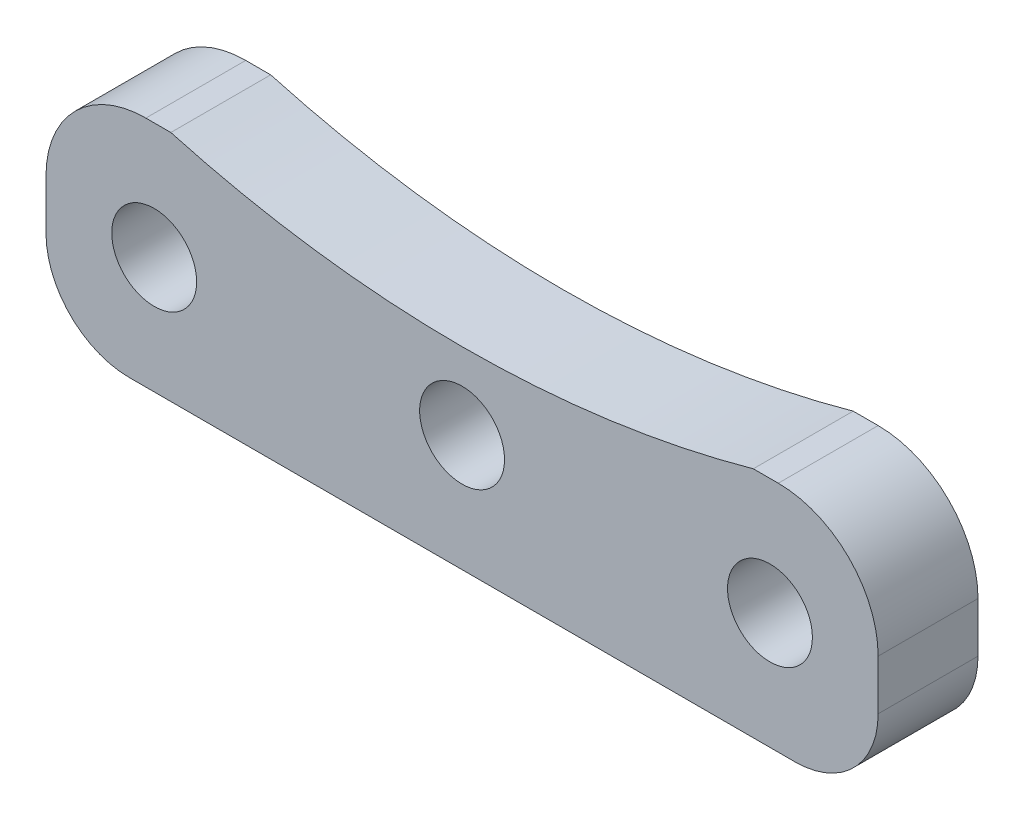
ISO-10303-21;
HEADER;
FILE_DESCRIPTION(('STEP AP214'),'2;1');
FILE_NAME('part.step','',(''),(''),'','','');
FILE_SCHEMA(('AUTOMOTIVE_DESIGN { 1 0 10303 214 1 1 1 1 }'));
ENDSEC;
DATA;
#1=APPLICATION_CONTEXT('core data for automotive mechanical design processes');
#2=APPLICATION_PROTOCOL_DEFINITION('international standard','automotive_design',2000,#1);
#3=PRODUCT_CONTEXT('',#1,'mechanical');
#4=PRODUCT('Part','Part','',(#3));
#5=PRODUCT_RELATED_PRODUCT_CATEGORY('part','',(#4));
#6=PRODUCT_DEFINITION_FORMATION('','',#4);
#7=PRODUCT_DEFINITION_CONTEXT('part definition',#1,'design');
#8=PRODUCT_DEFINITION('design','',#6,#7);
#9=PRODUCT_DEFINITION_SHAPE('','',#8);
#10=(LENGTH_UNIT() NAMED_UNIT(*) SI_UNIT(.MILLI.,.METRE.));
#11=(NAMED_UNIT(*) PLANE_ANGLE_UNIT() SI_UNIT($,.RADIAN.));
#12=(NAMED_UNIT(*) SI_UNIT($,.STERADIAN.) SOLID_ANGLE_UNIT());
#13=UNCERTAINTY_MEASURE_WITH_UNIT(LENGTH_MEASURE(1.E-05),#10,'distance_accuracy_value','');
#14=(GEOMETRIC_REPRESENTATION_CONTEXT(3) GLOBAL_UNCERTAINTY_ASSIGNED_CONTEXT((#13)) GLOBAL_UNIT_ASSIGNED_CONTEXT((#10,
#11,#12)) REPRESENTATION_CONTEXT('',''));
#15=CARTESIAN_POINT('',(0.,0.,0.));
#16=DIRECTION('',(0.,0.,1.));
#17=DIRECTION('',(1.,0.,0.));
#18=AXIS2_PLACEMENT_3D('',#15,#16,#17);
#19=CARTESIAN_POINT('',(896.804991665305,325.774798097188,6.));
#20=DIRECTION('',(0.,0.,-1.));
#21=DIRECTION('',(-1.,0.,0.));
#22=AXIS2_PLACEMENT_3D('',#19,#20,#21);
#23=CYLINDRICAL_SURFACE('',#22,65.1036279407735);
#24=CARTESIAN_POINT('',(896.804991665305,325.774798097188,0.));
#25=DIRECTION('',(0.,0.,1.));
#26=DIRECTION('',(1.,0.,0.));
#27=AXIS2_PLACEMENT_3D('',#24,#25,#26);
#28=CIRCLE('',#27,65.1036279407735);
#29=CARTESIAN_POINT('',(879.304991665024,263.067283626905,0.));
#30=VERTEX_POINT('',#29);
#31=CARTESIAN_POINT('',(914.304991665785,263.06728362696,0.));
#32=VERTEX_POINT('',#31);
#33=EDGE_CURVE('E11',#30,#32,#28,.T.);
#34=ORIENTED_EDGE('',*,*,#33,.F.);
#35=DIRECTION('',(0.,0.,-1.));
#36=VECTOR('',#35,1.);
#37=CARTESIAN_POINT('',(879.304991665024,263.067283626905,6.));
#38=LINE('',#37,#36);
#39=CARTESIAN_POINT('',(879.304991665024,263.067283626905,6.));
#40=VERTEX_POINT('',#39);
#41=EDGE_CURVE('E53',#40,#30,#38,.T.);
#42=ORIENTED_EDGE('',*,*,#41,.F.);
#43=CARTESIAN_POINT('',(896.804991665305,325.774798097188,6.));
#44=DIRECTION('',(0.,0.,1.));
#45=DIRECTION('',(1.,0.,0.));
#46=AXIS2_PLACEMENT_3D('',#43,#44,#45);
#47=CIRCLE('',#46,65.1036279407735);
#48=CARTESIAN_POINT('',(914.304991665785,263.06728362696,6.));
#49=VERTEX_POINT('',#48);
#50=EDGE_CURVE('E38',#40,#49,#47,.T.);
#51=ORIENTED_EDGE('',*,*,#50,.T.);
#52=DIRECTION('',(0.,0.,-1.));
#53=VECTOR('',#52,1.);
#54=CARTESIAN_POINT('',(914.304991665785,263.06728362696,6.));
#55=LINE('',#54,#53);
#56=EDGE_CURVE('E96',#49,#32,#55,.T.);
#57=ORIENTED_EDGE('',*,*,#56,.T.);
#58=EDGE_LOOP('',(#34,#42,#51,#57));
#59=FACE_BOUND('',#58,.T.);
#60=ADVANCED_FACE('F34',(#59),#23,.F.);
#61=CARTESIAN_POINT('',(1.92859169116805E-08,263.067283691368,6.));
#62=DIRECTION('',(-7.33117271028915E-11,-1.,0.));
#63=DIRECTION('',(1.,-7.33117271028915E-11,0.));
#64=AXIS2_PLACEMENT_3D('',#61,#62,#63);
#65=PLANE('',#64);
#66=DIRECTION('',(-1.,7.33117271028915E-11,0.));
#67=VECTOR('',#66,1.);
#68=CARTESIAN_POINT('',(1.92859169116805E-08,263.067283691368,0.));
#69=LINE('',#68,#67);
#70=CARTESIAN_POINT('',(877.804991665914,263.067283627015,0.));
#71=VERTEX_POINT('',#70);
#72=EDGE_CURVE('E44',#30,#71,#69,.T.);
#73=ORIENTED_EDGE('',*,*,#72,.T.);
#74=DIRECTION('',(0.,0.,-1.));
#75=VECTOR('',#74,1.);
#76=CARTESIAN_POINT('',(877.804991665914,263.067283627015,6.));
#77=LINE('',#76,#75);
#78=CARTESIAN_POINT('',(877.804991665914,263.067283627015,6.));
#79=VERTEX_POINT('',#78);
#80=EDGE_CURVE('E126',#79,#71,#77,.T.);
#81=ORIENTED_EDGE('',*,*,#80,.F.);
#82=DIRECTION('',(-1.,7.33117271028915E-11,0.));
#83=VECTOR('',#82,1.);
#84=CARTESIAN_POINT('',(1.92859169116805E-08,263.067283691368,6.));
#85=LINE('',#84,#83);
#86=EDGE_CURVE('E86',#40,#79,#85,.T.);
#87=ORIENTED_EDGE('',*,*,#86,.F.);
#88=ORIENTED_EDGE('',*,*,#41,.T.);
#89=EDGE_LOOP('',(#73,#81,#87,#88));
#90=FACE_BOUND('',#89,.T.);
#91=ADVANCED_FACE('F239',(#90),#65,.F.);
#92=CARTESIAN_POINT('',(877.804991665678,257.067283627129,6.));
#93=DIRECTION('',(0.,0.,-1.));
#94=DIRECTION('',(-1.,0.,0.));
#95=AXIS2_PLACEMENT_3D('',#92,#93,#94);
#96=CYLINDRICAL_SURFACE('',#95,5.99999999988587);
#97=CARTESIAN_POINT('',(877.804991665678,257.067283627129,0.));
#98=DIRECTION('',(0.,0.,1.));
#99=DIRECTION('',(1.,0.,0.));
#100=AXIS2_PLACEMENT_3D('',#97,#98,#99);
#101=CIRCLE('',#100,5.99999999988587);
#102=CARTESIAN_POINT('',(871.804991665792,257.067283627129,0.));
#103=VERTEX_POINT('',#102);
#104=EDGE_CURVE('E120',#71,#103,#101,.T.);
#105=ORIENTED_EDGE('',*,*,#104,.T.);
#106=DIRECTION('',(0.,0.,-1.));
#107=VECTOR('',#106,1.);
#108=CARTESIAN_POINT('',(871.804991665792,257.067283627129,6.));
#109=LINE('',#108,#107);
#110=CARTESIAN_POINT('',(871.804991665792,257.067283627129,6.));
#111=VERTEX_POINT('',#110);
#112=EDGE_CURVE('E124',#111,#103,#109,.T.);
#113=ORIENTED_EDGE('',*,*,#112,.F.);
#114=CARTESIAN_POINT('',(877.804991665678,257.067283627129,6.));
#115=DIRECTION('',(0.,0.,1.));
#116=DIRECTION('',(1.,0.,0.));
#117=AXIS2_PLACEMENT_3D('',#114,#115,#116);
#118=CIRCLE('',#117,5.99999999988587);
#119=EDGE_CURVE('E171',#79,#111,#118,.T.);
#120=ORIENTED_EDGE('',*,*,#119,.F.);
#121=ORIENTED_EDGE('',*,*,#80,.T.);
#122=EDGE_LOOP('',(#105,#113,#120,#121));
#123=FACE_BOUND('',#122,.T.);
#124=ADVANCED_FACE('F122',(#123),#96,.T.);
#125=CARTESIAN_POINT('',(871.804991681812,5.43313396423105E-08,6.));
#126=DIRECTION('',(1.,6.23205191077182E-11,0.));
#127=DIRECTION('',(-6.23205191077182E-11,1.,0.));
#128=AXIS2_PLACEMENT_3D('',#125,#126,#127);
#129=PLANE('',#128);
#130=DIRECTION('',(6.23205191077182E-11,-1.,0.));
#131=VECTOR('',#130,1.);
#132=CARTESIAN_POINT('',(871.804991681812,5.43313396423105E-08,0.));
#133=LINE('',#132,#131);
#134=CARTESIAN_POINT('',(871.804991665979,254.067283626748,0.));
#135=VERTEX_POINT('',#134);
#136=EDGE_CURVE('E129',#103,#135,#133,.T.);
#137=ORIENTED_EDGE('',*,*,#136,.T.);
#138=DIRECTION('',(0.,0.,-1.));
#139=VECTOR('',#138,1.);
#140=CARTESIAN_POINT('',(871.804991665979,254.067283626748,6.));
#141=LINE('',#140,#139);
#142=CARTESIAN_POINT('',(871.804991665979,254.067283626748,6.));
#143=VERTEX_POINT('',#142);
#144=EDGE_CURVE('E136',#143,#135,#141,.T.);
#145=ORIENTED_EDGE('',*,*,#144,.F.);
#146=DIRECTION('',(6.23205191077182E-11,-1.,0.));
#147=VECTOR('',#146,1.);
#148=CARTESIAN_POINT('',(871.804991681812,5.43313396423105E-08,6.));
#149=LINE('',#148,#147);
#150=EDGE_CURVE('E135',#111,#143,#149,.T.);
#151=ORIENTED_EDGE('',*,*,#150,.F.);
#152=ORIENTED_EDGE('',*,*,#112,.T.);
#153=EDGE_LOOP('',(#137,#145,#151,#152));
#154=FACE_BOUND('',#153,.T.);
#155=ADVANCED_FACE('F132',(#154),#129,.F.);
#156=CARTESIAN_POINT('',(876.804991665979,254.06728362706,6.));
#157=DIRECTION('',(0.,0.,-1.));
#158=DIRECTION('',(-1.,0.,0.));
#159=AXIS2_PLACEMENT_3D('',#156,#157,#158);
#160=CYLINDRICAL_SURFACE('',#159,4.99999999999995);
#161=CARTESIAN_POINT('',(876.804991665979,254.06728362706,0.));
#162=DIRECTION('',(0.,0.,1.));
#163=DIRECTION('',(1.,0.,0.));
#164=AXIS2_PLACEMENT_3D('',#161,#162,#163);
#165=CIRCLE('',#164,4.99999999999995);
#166=CARTESIAN_POINT('',(876.804991665979,249.06728362706,0.));
#167=VERTEX_POINT('',#166);
#168=EDGE_CURVE('E142',#135,#167,#165,.T.);
#169=ORIENTED_EDGE('',*,*,#168,.T.);
#170=DIRECTION('',(0.,0.,-1.));
#171=VECTOR('',#170,1.);
#172=CARTESIAN_POINT('',(876.804991665979,249.06728362706,6.));
#173=LINE('',#172,#171);
#174=CARTESIAN_POINT('',(876.804991665979,249.06728362706,6.));
#175=VERTEX_POINT('',#174);
#176=EDGE_CURVE('E202',#175,#167,#173,.T.);
#177=ORIENTED_EDGE('',*,*,#176,.F.);
#178=CARTESIAN_POINT('',(876.804991665979,254.06728362706,6.));
#179=DIRECTION('',(0.,0.,1.));
#180=DIRECTION('',(1.,0.,0.));
#181=AXIS2_PLACEMENT_3D('',#178,#179,#180);
#182=CIRCLE('',#181,4.99999999999995);
#183=EDGE_CURVE('E168',#143,#175,#182,.T.);
#184=ORIENTED_EDGE('',*,*,#183,.F.);
#185=ORIENTED_EDGE('',*,*,#144,.T.);
#186=EDGE_LOOP('',(#169,#177,#184,#185));
#187=FACE_BOUND('',#186,.T.);
#188=ADVANCED_FACE('F233',(#187),#160,.T.);
#189=CARTESIAN_POINT('',(0.,249.06728362706,6.));
#190=DIRECTION('',(0.,1.,0.));
#191=DIRECTION('',(0.,0.,1.));
#192=AXIS2_PLACEMENT_3D('',#189,#190,#191);
#193=PLANE('',#192);
#194=DIRECTION('',(1.,0.,0.));
#195=VECTOR('',#194,1.);
#196=CARTESIAN_POINT('',(0.,249.06728362706,0.));
#197=LINE('',#196,#195);
#198=CARTESIAN_POINT('',(916.804991665603,249.06728362706,0.));
#199=VERTEX_POINT('',#198);
#200=EDGE_CURVE('E144',#167,#199,#197,.T.);
#201=ORIENTED_EDGE('',*,*,#200,.T.);
#202=DIRECTION('',(0.,0.,-1.));
#203=VECTOR('',#202,1.);
#204=CARTESIAN_POINT('',(916.804991665603,249.06728362706,6.));
#205=LINE('',#204,#203);
#206=CARTESIAN_POINT('',(916.804991665603,249.06728362706,6.));
#207=VERTEX_POINT('',#206);
#208=EDGE_CURVE('E199',#207,#199,#205,.T.);
#209=ORIENTED_EDGE('',*,*,#208,.F.);
#210=DIRECTION('',(1.,0.,0.));
#211=VECTOR('',#210,1.);
#212=CARTESIAN_POINT('',(0.,249.06728362706,6.));
#213=LINE('',#212,#211);
#214=EDGE_CURVE('E166',#175,#207,#213,.T.);
#215=ORIENTED_EDGE('',*,*,#214,.F.);
#216=ORIENTED_EDGE('',*,*,#176,.T.);
#217=EDGE_LOOP('',(#201,#209,#215,#216));
#218=FACE_BOUND('',#217,.T.);
#219=ADVANCED_FACE('F197',(#218),#193,.F.);
#220=CARTESIAN_POINT('',(916.804991665604,254.06728362706,6.));
#221=DIRECTION('',(0.,0.,-1.));
#222=DIRECTION('',(-1.,0.,0.));
#223=AXIS2_PLACEMENT_3D('',#220,#221,#222);
#224=CYLINDRICAL_SURFACE('',#223,5.);
#225=CARTESIAN_POINT('',(916.804991665604,254.06728362706,0.));
#226=DIRECTION('',(0.,0.,1.));
#227=DIRECTION('',(1.,0.,0.));
#228=AXIS2_PLACEMENT_3D('',#225,#226,#227);
#229=CIRCLE('',#228,5.);
#230=CARTESIAN_POINT('',(921.804991665604,254.067283626743,0.));
#231=VERTEX_POINT('',#230);
#232=EDGE_CURVE('E192',#199,#231,#229,.T.);
#233=ORIENTED_EDGE('',*,*,#232,.T.);
#234=DIRECTION('',(0.,0.,-1.));
#235=VECTOR('',#234,1.);
#236=CARTESIAN_POINT('',(921.804991665604,254.067283626743,6.));
#237=LINE('',#236,#235);
#238=CARTESIAN_POINT('',(921.804991665604,254.067283626743,6.));
#239=VERTEX_POINT('',#238);
#240=EDGE_CURVE('E208',#239,#231,#237,.T.);
#241=ORIENTED_EDGE('',*,*,#240,.F.);
#242=CARTESIAN_POINT('',(916.804991665604,254.06728362706,6.));
#243=DIRECTION('',(0.,0.,1.));
#244=DIRECTION('',(1.,0.,0.));
#245=AXIS2_PLACEMENT_3D('',#242,#243,#244);
#246=CIRCLE('',#245,5.);
#247=EDGE_CURVE('E164',#207,#239,#246,.T.);
#248=ORIENTED_EDGE('',*,*,#247,.F.);
#249=ORIENTED_EDGE('',*,*,#208,.T.);
#250=EDGE_LOOP('',(#233,#241,#248,#249));
#251=FACE_BOUND('',#250,.T.);
#252=ADVANCED_FACE('F205',(#251),#224,.T.);
#253=CARTESIAN_POINT('',(921.804991649563,-5.81978888900577E-08,6.));
#254=DIRECTION('',(-1.,6.31347079016279E-11,0.));
#255=DIRECTION('',(-6.31347079016279E-11,-1.,0.));
#256=AXIS2_PLACEMENT_3D('',#253,#254,#255);
#257=PLANE('',#256);
#258=DIRECTION('',(6.31347079016279E-11,1.,0.));
#259=VECTOR('',#258,1.);
#260=CARTESIAN_POINT('',(921.804991649563,-5.81978888900577E-08,0.));
#261=LINE('',#260,#259);
#262=CARTESIAN_POINT('',(921.804991665793,257.067282427658,0.));
#263=VERTEX_POINT('',#262);
#264=EDGE_CURVE('E190',#231,#263,#261,.T.);
#265=ORIENTED_EDGE('',*,*,#264,.T.);
#266=DIRECTION('',(0.,0.,-1.));
#267=VECTOR('',#266,1.);
#268=CARTESIAN_POINT('',(921.804991665793,257.067282427658,6.));
#269=LINE('',#268,#267);
#270=CARTESIAN_POINT('',(921.804991665793,257.067282427658,6.));
#271=VERTEX_POINT('',#270);
#272=EDGE_CURVE('E218',#271,#263,#269,.T.);
#273=ORIENTED_EDGE('',*,*,#272,.F.);
#274=DIRECTION('',(6.31347079016279E-11,1.,0.));
#275=VECTOR('',#274,1.);
#276=CARTESIAN_POINT('',(921.804991649563,-5.81978888900577E-08,6.));
#277=LINE('',#276,#275);
#278=EDGE_CURVE('E162',#239,#271,#277,.T.);
#279=ORIENTED_EDGE('',*,*,#278,.F.);
#280=ORIENTED_EDGE('',*,*,#240,.T.);
#281=EDGE_LOOP('',(#265,#273,#279,#280));
#282=FACE_BOUND('',#281,.T.);
#283=ADVANCED_FACE('F216',(#282),#257,.F.);
#284=CARTESIAN_POINT('',(915.804989618165,257.067281579468,6.));
#285=DIRECTION('',(0.,0.,-1.));
#286=DIRECTION('',(-1.,0.,0.));
#287=AXIS2_PLACEMENT_3D('',#284,#285,#286);
#288=CYLINDRICAL_SURFACE('',#287,6.00000204762792);
#289=CARTESIAN_POINT('',(915.804989618165,257.067281579468,0.));
#290=DIRECTION('',(0.,0.,1.));
#291=DIRECTION('',(1.,0.,0.));
#292=AXIS2_PLACEMENT_3D('',#289,#290,#291);
#293=CIRCLE('',#292,6.00000204762792);
#294=CARTESIAN_POINT('',(915.80499166548,263.067283627096,0.));
#295=VERTEX_POINT('',#294);
#296=EDGE_CURVE('E188',#263,#295,#293,.T.);
#297=ORIENTED_EDGE('',*,*,#296,.T.);
#298=DIRECTION('',(0.,0.,-1.));
#299=VECTOR('',#298,1.);
#300=CARTESIAN_POINT('',(915.80499166548,263.067283627096,6.));
#301=LINE('',#300,#299);
#302=CARTESIAN_POINT('',(915.80499166548,263.067283627096,6.));
#303=VERTEX_POINT('',#302);
#304=EDGE_CURVE('E224',#303,#295,#301,.T.);
#305=ORIENTED_EDGE('',*,*,#304,.F.);
#306=CARTESIAN_POINT('',(915.804989618165,257.067281579468,6.));
#307=DIRECTION('',(0.,0.,1.));
#308=DIRECTION('',(1.,0.,0.));
#309=AXIS2_PLACEMENT_3D('',#306,#307,#308);
#310=CIRCLE('',#309,6.00000204762792);
#311=EDGE_CURVE('E160',#271,#303,#310,.T.);
#312=ORIENTED_EDGE('',*,*,#311,.F.);
#313=ORIENTED_EDGE('',*,*,#272,.T.);
#314=EDGE_LOOP('',(#297,#305,#312,#313));
#315=FACE_BOUND('',#314,.T.);
#316=ADVANCED_FACE('F221',(#315),#288,.T.);
#317=CARTESIAN_POINT('',(878.304991665792,256.06728362706,6.));
#318=DIRECTION('',(0.,0.,-1.));
#319=DIRECTION('',(-1.,0.,0.));
#320=AXIS2_PLACEMENT_3D('',#317,#318,#319);
#321=CYLINDRICAL_SURFACE('',#320,2.55000000000005);
#322=CARTESIAN_POINT('',(878.304991665792,256.06728362706,6.));
#323=DIRECTION('',(0.,0.,1.));
#324=DIRECTION('',(1.,0.,0.));
#325=AXIS2_PLACEMENT_3D('',#322,#323,#324);
#326=CIRCLE('',#325,2.55000000000005);
#327=CARTESIAN_POINT('',(880.854991665792,256.06728362706,6.));
#328=VERTEX_POINT('',#327);
#329=EDGE_CURVE('E152',#328,#328,#326,.T.);
#330=ORIENTED_EDGE('',*,*,#329,.T.);
#331=EDGE_LOOP('',(#330));
#332=FACE_BOUND('',#331,.T.);
#333=CARTESIAN_POINT('',(878.304991665792,256.06728362706,0.));
#334=DIRECTION('',(0.,0.,1.));
#335=DIRECTION('',(1.,0.,0.));
#336=AXIS2_PLACEMENT_3D('',#333,#334,#335);
#337=CIRCLE('',#336,2.55000000000005);
#338=CARTESIAN_POINT('',(880.854991665792,256.06728362706,0.));
#339=VERTEX_POINT('',#338);
#340=EDGE_CURVE('E174',#339,#339,#337,.T.);
#341=ORIENTED_EDGE('',*,*,#340,.F.);
#342=EDGE_LOOP('',(#341));
#343=FACE_BOUND('',#342,.T.);
#344=ADVANCED_FACE('F260',(#332,#343),#321,.F.);
#345=CARTESIAN_POINT('',(896.804991665792,256.06728362706,6.));
#346=DIRECTION('',(0.,0.,-1.));
#347=DIRECTION('',(-1.,0.,0.));
#348=AXIS2_PLACEMENT_3D('',#345,#346,#347);
#349=CYLINDRICAL_SURFACE('',#348,2.55000000000005);
#350=CARTESIAN_POINT('',(896.804991665792,256.06728362706,6.));
#351=DIRECTION('',(0.,0.,1.));
#352=DIRECTION('',(1.,0.,0.));
#353=AXIS2_PLACEMENT_3D('',#350,#351,#352);
#354=CIRCLE('',#353,2.55000000000005);
#355=CARTESIAN_POINT('',(899.354991665793,256.06728362706,6.));
#356=VERTEX_POINT('',#355);
#357=EDGE_CURVE('E155',#356,#356,#354,.T.);
#358=ORIENTED_EDGE('',*,*,#357,.T.);
#359=EDGE_LOOP('',(#358));
#360=FACE_BOUND('',#359,.T.);
#361=CARTESIAN_POINT('',(896.804991665792,256.06728362706,0.));
#362=DIRECTION('',(0.,0.,1.));
#363=DIRECTION('',(1.,0.,0.));
#364=AXIS2_PLACEMENT_3D('',#361,#362,#363);
#365=CIRCLE('',#364,2.55000000000005);
#366=CARTESIAN_POINT('',(899.354991665793,256.06728362706,0.));
#367=VERTEX_POINT('',#366);
#368=EDGE_CURVE('E179',#367,#367,#365,.T.);
#369=ORIENTED_EDGE('',*,*,#368,.F.);
#370=EDGE_LOOP('',(#369));
#371=FACE_BOUND('',#370,.T.);
#372=ADVANCED_FACE('F264',(#360,#371),#349,.F.);
#373=CARTESIAN_POINT('',(-2.37934280098078E-08,263.067283544265,6.));
#374=DIRECTION('',(9.04461690912021E-11,-1.,0.));
#375=DIRECTION('',(1.,9.04461690912021E-11,0.));
#376=AXIS2_PLACEMENT_3D('',#373,#374,#375);
#377=PLANE('',#376);
#378=DIRECTION('',(-1.,-9.04461690912022E-11,0.));
#379=VECTOR('',#378,1.);
#380=CARTESIAN_POINT('',(-2.37934280098078E-08,263.067283544265,0.));
#381=LINE('',#380,#379);
#382=EDGE_CURVE('E186',#295,#32,#381,.T.);
#383=ORIENTED_EDGE('',*,*,#382,.T.);
#384=ORIENTED_EDGE('',*,*,#56,.F.);
#385=DIRECTION('',(-1.,-9.04461690912022E-11,0.));
#386=VECTOR('',#385,1.);
#387=CARTESIAN_POINT('',(-2.37934280098078E-08,263.067283544265,6.));
#388=LINE('',#387,#386);
#389=EDGE_CURVE('E158',#303,#49,#388,.T.);
#390=ORIENTED_EDGE('',*,*,#389,.F.);
#391=ORIENTED_EDGE('',*,*,#304,.T.);
#392=EDGE_LOOP('',(#383,#384,#390,#391));
#393=FACE_BOUND('',#392,.T.);
#394=ADVANCED_FACE('F237',(#393),#377,.F.);
#395=CARTESIAN_POINT('',(915.304991665793,256.06728362706,6.));
#396=DIRECTION('',(0.,0.,-1.));
#397=DIRECTION('',(-1.,0.,0.));
#398=AXIS2_PLACEMENT_3D('',#395,#396,#397);
#399=CYLINDRICAL_SURFACE('',#398,2.55000000000005);
#400=CARTESIAN_POINT('',(915.304991665793,256.06728362706,6.));
#401=DIRECTION('',(0.,0.,1.));
#402=DIRECTION('',(1.,0.,0.));
#403=AXIS2_PLACEMENT_3D('',#400,#401,#402);
#404=CIRCLE('',#403,2.55000000000005);
#405=CARTESIAN_POINT('',(917.854991665793,256.06728362706,6.));
#406=VERTEX_POINT('',#405);
#407=EDGE_CURVE('E149',#406,#406,#404,.T.);
#408=ORIENTED_EDGE('',*,*,#407,.T.);
#409=EDGE_LOOP('',(#408));
#410=FACE_BOUND('',#409,.T.);
#411=CARTESIAN_POINT('',(915.304991665793,256.06728362706,0.));
#412=DIRECTION('',(0.,0.,1.));
#413=DIRECTION('',(1.,0.,0.));
#414=AXIS2_PLACEMENT_3D('',#411,#412,#413);
#415=CIRCLE('',#414,2.55000000000005);
#416=CARTESIAN_POINT('',(917.854991665793,256.06728362706,0.));
#417=VERTEX_POINT('',#416);
#418=EDGE_CURVE('E172',#417,#417,#415,.T.);
#419=ORIENTED_EDGE('',*,*,#418,.F.);
#420=EDGE_LOOP('',(#419));
#421=FACE_BOUND('',#420,.T.);
#422=ADVANCED_FACE('F263',(#410,#421),#399,.F.);
#423=CARTESIAN_POINT('',(0.,0.,6.));
#424=DIRECTION('',(0.,0.,1.));
#425=DIRECTION('',(1.,0.,0.));
#426=AXIS2_PLACEMENT_3D('',#423,#424,#425);
#427=PLANE('',#426);
#428=ORIENTED_EDGE('',*,*,#50,.F.);
#429=ORIENTED_EDGE('',*,*,#86,.T.);
#430=ORIENTED_EDGE('',*,*,#119,.T.);
#431=ORIENTED_EDGE('',*,*,#150,.T.);
#432=ORIENTED_EDGE('',*,*,#183,.T.);
#433=ORIENTED_EDGE('',*,*,#214,.T.);
#434=ORIENTED_EDGE('',*,*,#247,.T.);
#435=ORIENTED_EDGE('',*,*,#278,.T.);
#436=ORIENTED_EDGE('',*,*,#311,.T.);
#437=ORIENTED_EDGE('',*,*,#389,.T.);
#438=EDGE_LOOP('',(#428,#429,#430,#431,#432,#433,#434,#435,#436,#437));
#439=FACE_BOUND('',#438,.T.);
#440=ORIENTED_EDGE('',*,*,#357,.F.);
#441=EDGE_LOOP('',(#440));
#442=FACE_BOUND('',#441,.T.);
#443=ORIENTED_EDGE('',*,*,#329,.F.);
#444=EDGE_LOOP('',(#443));
#445=FACE_BOUND('',#444,.T.);
#446=ORIENTED_EDGE('',*,*,#407,.F.);
#447=EDGE_LOOP('',(#446));
#448=FACE_BOUND('',#447,.T.);
#449=ADVANCED_FACE('F36',(#439,#442,#445,#448),#427,.T.);
#450=CARTESIAN_POINT('',(0.,0.,0.));
#451=DIRECTION('',(0.,0.,1.));
#452=DIRECTION('',(1.,0.,0.));
#453=AXIS2_PLACEMENT_3D('',#450,#451,#452);
#454=PLANE('',#453);
#455=ORIENTED_EDGE('',*,*,#33,.T.);
#456=ORIENTED_EDGE('',*,*,#382,.F.);
#457=ORIENTED_EDGE('',*,*,#296,.F.);
#458=ORIENTED_EDGE('',*,*,#264,.F.);
#459=ORIENTED_EDGE('',*,*,#232,.F.);
#460=ORIENTED_EDGE('',*,*,#200,.F.);
#461=ORIENTED_EDGE('',*,*,#168,.F.);
#462=ORIENTED_EDGE('',*,*,#136,.F.);
#463=ORIENTED_EDGE('',*,*,#104,.F.);
#464=ORIENTED_EDGE('',*,*,#72,.F.);
#465=EDGE_LOOP('',(#455,#456,#457,#458,#459,#460,#461,#462,#463,#464));
#466=FACE_BOUND('',#465,.T.);
#467=ORIENTED_EDGE('',*,*,#368,.T.);
#468=EDGE_LOOP('',(#467));
#469=FACE_BOUND('',#468,.T.);
#470=ORIENTED_EDGE('',*,*,#340,.T.);
#471=EDGE_LOOP('',(#470));
#472=FACE_BOUND('',#471,.T.);
#473=ORIENTED_EDGE('',*,*,#418,.T.);
#474=EDGE_LOOP('',(#473));
#475=FACE_BOUND('',#474,.T.);
#476=ADVANCED_FACE('F139',(#466,#469,#472,#475),#454,.F.);
#477=CLOSED_SHELL('',(#60,#91,#124,#155,#188,#219,#252,#283,#316,#344,#372,#394,#422,#449,#476));
#478=MANIFOLD_SOLID_BREP('B2',#477);
#479=ADVANCED_BREP_SHAPE_REPRESENTATION('',(#18,#478),#14);
#480=SHAPE_DEFINITION_REPRESENTATION(#9,#479);
ENDSEC;
END-ISO-10303-21;
